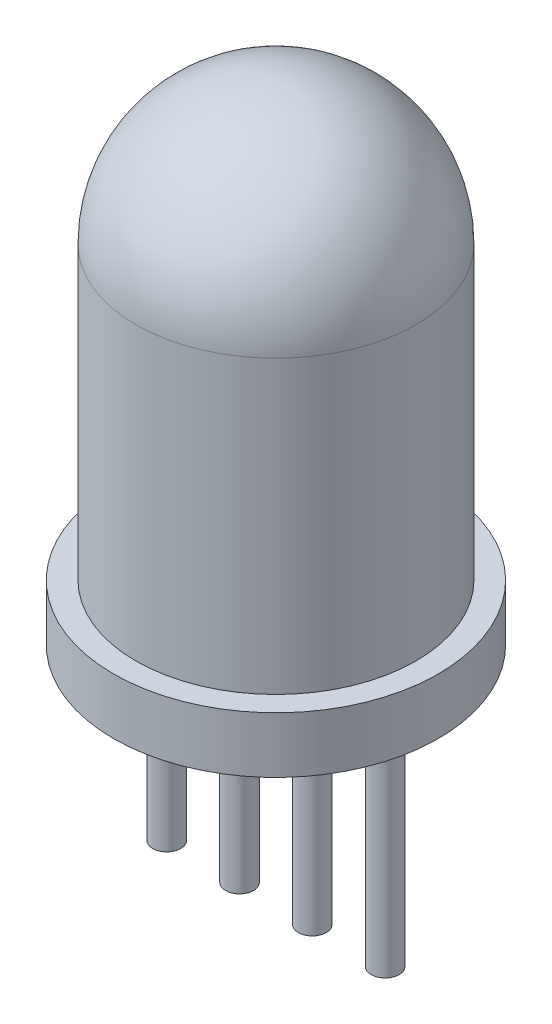
ISO-10303-21;
HEADER;
FILE_DESCRIPTION(('STEP AP214'),'2;1');
FILE_NAME('part.step','',(''),(''),'','','');
FILE_SCHEMA(('AUTOMOTIVE_DESIGN { 1 0 10303 214 1 1 1 1 }'));
ENDSEC;
DATA;
#1=APPLICATION_CONTEXT('core data for automotive mechanical design processes');
#2=APPLICATION_PROTOCOL_DEFINITION('international standard','automotive_design',2000,#1);
#3=PRODUCT_CONTEXT('',#1,'mechanical');
#4=PRODUCT('Part','Part','',(#3));
#5=PRODUCT_RELATED_PRODUCT_CATEGORY('part','',(#4));
#6=PRODUCT_DEFINITION_FORMATION('','',#4);
#7=PRODUCT_DEFINITION_CONTEXT('part definition',#1,'design');
#8=PRODUCT_DEFINITION('design','',#6,#7);
#9=PRODUCT_DEFINITION_SHAPE('','',#8);
#10=(LENGTH_UNIT() NAMED_UNIT(*) SI_UNIT(.MILLI.,.METRE.));
#11=(NAMED_UNIT(*) PLANE_ANGLE_UNIT() SI_UNIT($,.RADIAN.));
#12=(NAMED_UNIT(*) SI_UNIT($,.STERADIAN.) SOLID_ANGLE_UNIT());
#13=UNCERTAINTY_MEASURE_WITH_UNIT(LENGTH_MEASURE(1.E-05),#10,'distance_accuracy_value','');
#14=(GEOMETRIC_REPRESENTATION_CONTEXT(3) GLOBAL_UNCERTAINTY_ASSIGNED_CONTEXT((#13)) GLOBAL_UNIT_ASSIGNED_CONTEXT((#10,
#11,#12)) REPRESENTATION_CONTEXT('',''));
#15=CARTESIAN_POINT('',(0.,0.,0.));
#16=DIRECTION('',(0.,0.,1.));
#17=DIRECTION('',(1.,0.,0.));
#18=AXIS2_PLACEMENT_3D('',#15,#16,#17);
#19=CARTESIAN_POINT('',(0.,6.2,0.));
#20=DIRECTION('',(0.,1.,0.));
#21=DIRECTION('',(0.,0.,-1.));
#22=AXIS2_PLACEMENT_3D('',#19,#20,#21);
#23=SPHERICAL_SURFACE('',#22,2.5);
#24=CARTESIAN_POINT('',(0.,6.2,0.));
#25=DIRECTION('',(0.,1.,0.));
#26=DIRECTION('',(0.,0.,1.));
#27=AXIS2_PLACEMENT_3D('',#24,#25,#26);
#28=CIRCLE('',#27,2.5);
#29=CARTESIAN_POINT('',(0.,6.2,2.5));
#30=VERTEX_POINT('',#29);
#31=EDGE_CURVE('E49',#30,#30,#28,.T.);
#32=ORIENTED_EDGE('',*,*,#31,.T.);
#33=EDGE_LOOP('',(#32));
#34=FACE_BOUND('',#33,.T.);
#35=ADVANCED_FACE('F35',(#34),#23,.T.);
#36=CARTESIAN_POINT('',(0.,0.,2.9));
#37=DIRECTION('',(0.,-1.,0.));
#38=DIRECTION('',(0.,0.,-1.));
#39=AXIS2_PLACEMENT_3D('',#36,#37,#38);
#40=PLANE('',#39);
#41=CARTESIAN_POINT('',(1.95,0.,0.));
#42=DIRECTION('',(0.,-1.,0.));
#43=DIRECTION('',(0.,0.,1.));
#44=AXIS2_PLACEMENT_3D('',#41,#42,#43);
#45=CIRCLE('',#44,0.25);
#46=CARTESIAN_POINT('',(1.95,0.,0.250000000000001));
#47=VERTEX_POINT('',#46);
#48=EDGE_CURVE('E70',#47,#47,#45,.T.);
#49=ORIENTED_EDGE('',*,*,#48,.F.);
#50=EDGE_LOOP('',(#49));
#51=FACE_BOUND('',#50,.T.);
#52=CARTESIAN_POINT('',(0.65,0.,0.));
#53=DIRECTION('',(0.,-1.,0.));
#54=DIRECTION('',(0.,0.,1.));
#55=AXIS2_PLACEMENT_3D('',#52,#53,#54);
#56=CIRCLE('',#55,0.25);
#57=CARTESIAN_POINT('',(0.65,0.,0.25));
#58=VERTEX_POINT('',#57);
#59=EDGE_CURVE('E64',#58,#58,#56,.T.);
#60=ORIENTED_EDGE('',*,*,#59,.F.);
#61=EDGE_LOOP('',(#60));
#62=FACE_BOUND('',#61,.T.);
#63=CARTESIAN_POINT('',(-0.65,0.,0.));
#64=DIRECTION('',(0.,-1.,0.));
#65=DIRECTION('',(0.,0.,-1.));
#66=AXIS2_PLACEMENT_3D('',#63,#64,#65);
#67=CIRCLE('',#66,0.25);
#68=CARTESIAN_POINT('',(-0.65,0.,-0.25));
#69=VERTEX_POINT('',#68);
#70=EDGE_CURVE('E58',#69,#69,#67,.T.);
#71=ORIENTED_EDGE('',*,*,#70,.F.);
#72=EDGE_LOOP('',(#71));
#73=FACE_BOUND('',#72,.T.);
#74=CARTESIAN_POINT('',(-1.95,0.,0.));
#75=DIRECTION('',(0.,-1.,0.));
#76=DIRECTION('',(0.,0.,-1.));
#77=AXIS2_PLACEMENT_3D('',#74,#75,#76);
#78=CIRCLE('',#77,0.25);
#79=CARTESIAN_POINT('',(-1.95,0.,-0.25));
#80=VERTEX_POINT('',#79);
#81=EDGE_CURVE('E55',#80,#80,#78,.T.);
#82=ORIENTED_EDGE('',*,*,#81,.F.);
#83=EDGE_LOOP('',(#82));
#84=FACE_BOUND('',#83,.T.);
#85=CARTESIAN_POINT('',(0.,0.,0.));
#86=DIRECTION('',(0.,1.,0.));
#87=DIRECTION('',(0.,0.,1.));
#88=AXIS2_PLACEMENT_3D('',#85,#86,#87);
#89=CIRCLE('',#88,2.9);
#90=CARTESIAN_POINT('',(0.,0.,2.9));
#91=VERTEX_POINT('',#90);
#92=EDGE_CURVE('E10',#91,#91,#89,.T.);
#93=ORIENTED_EDGE('',*,*,#92,.F.);
#94=EDGE_LOOP('',(#93));
#95=FACE_BOUND('',#94,.T.);
#96=ADVANCED_FACE('F81',(#51,#62,#73,#84,#95),#40,.T.);
#97=CARTESIAN_POINT('',(0.,16.4775973247295,0.));
#98=DIRECTION('',(0.,1.,0.));
#99=DIRECTION('',(0.,0.,1.));
#100=AXIS2_PLACEMENT_3D('',#97,#98,#99);
#101=CYLINDRICAL_SURFACE('',#100,2.9);
#102=ORIENTED_EDGE('',*,*,#92,.T.);
#103=EDGE_LOOP('',(#102));
#104=FACE_BOUND('',#103,.T.);
#105=CARTESIAN_POINT('',(0.,1.,0.));
#106=DIRECTION('',(0.,1.,0.));
#107=DIRECTION('',(0.,0.,1.));
#108=AXIS2_PLACEMENT_3D('',#105,#106,#107);
#109=CIRCLE('',#108,2.9);
#110=CARTESIAN_POINT('',(0.,1.,2.9));
#111=VERTEX_POINT('',#110);
#112=EDGE_CURVE('E41',#111,#111,#109,.T.);
#113=ORIENTED_EDGE('',*,*,#112,.F.);
#114=EDGE_LOOP('',(#113));
#115=FACE_BOUND('',#114,.T.);
#116=ADVANCED_FACE('F84',(#104,#115),#101,.T.);
#117=CARTESIAN_POINT('',(0.,1.,2.5));
#118=DIRECTION('',(0.,1.,0.));
#119=DIRECTION('',(0.,0.,1.));
#120=AXIS2_PLACEMENT_3D('',#117,#118,#119);
#121=PLANE('',#120);
#122=ORIENTED_EDGE('',*,*,#112,.T.);
#123=EDGE_LOOP('',(#122));
#124=FACE_BOUND('',#123,.T.);
#125=CARTESIAN_POINT('',(0.,1.,0.));
#126=DIRECTION('',(0.,1.,0.));
#127=DIRECTION('',(0.,0.,1.));
#128=AXIS2_PLACEMENT_3D('',#125,#126,#127);
#129=CIRCLE('',#128,2.5);
#130=CARTESIAN_POINT('',(0.,1.,2.5));
#131=VERTEX_POINT('',#130);
#132=EDGE_CURVE('E45',#131,#131,#129,.T.);
#133=ORIENTED_EDGE('',*,*,#132,.F.);
#134=EDGE_LOOP('',(#133));
#135=FACE_BOUND('',#134,.T.);
#136=ADVANCED_FACE('F105',(#124,#135),#121,.T.);
#137=CARTESIAN_POINT('',(0.,16.4775973247295,0.));
#138=DIRECTION('',(0.,1.,0.));
#139=DIRECTION('',(0.,0.,1.));
#140=AXIS2_PLACEMENT_3D('',#137,#138,#139);
#141=CYLINDRICAL_SURFACE('',#140,2.5);
#142=ORIENTED_EDGE('',*,*,#132,.T.);
#143=EDGE_LOOP('',(#142));
#144=FACE_BOUND('',#143,.T.);
#145=ORIENTED_EDGE('',*,*,#31,.F.);
#146=EDGE_LOOP('',(#145));
#147=FACE_BOUND('',#146,.T.);
#148=ADVANCED_FACE('F95',(#144,#147),#141,.T.);
#149=CARTESIAN_POINT('',(-1.95,-4.,0.));
#150=DIRECTION('',(0.,1.,0.));
#151=DIRECTION('',(0.,0.,1.));
#152=AXIS2_PLACEMENT_3D('',#149,#150,#151);
#153=CYLINDRICAL_SURFACE('',#152,0.25);
#154=CARTESIAN_POINT('',(-1.95,-4.,0.));
#155=DIRECTION('',(0.,-1.,0.));
#156=DIRECTION('',(0.,0.,-1.));
#157=AXIS2_PLACEMENT_3D('',#154,#155,#156);
#158=CIRCLE('',#157,0.25);
#159=CARTESIAN_POINT('',(-1.95,-4.,-0.25));
#160=VERTEX_POINT('',#159);
#161=EDGE_CURVE('E54',#160,#160,#158,.T.);
#162=ORIENTED_EDGE('',*,*,#161,.F.);
#163=EDGE_LOOP('',(#162));
#164=FACE_BOUND('',#163,.T.);
#165=ORIENTED_EDGE('',*,*,#81,.T.);
#166=EDGE_LOOP('',(#165));
#167=FACE_BOUND('',#166,.T.);
#168=ADVANCED_FACE('F92',(#164,#167),#153,.T.);
#169=CARTESIAN_POINT('',(-1.95,-4.,0.));
#170=DIRECTION('',(0.,-1.,0.));
#171=DIRECTION('',(0.,0.,-1.));
#172=AXIS2_PLACEMENT_3D('',#169,#170,#171);
#173=PLANE('',#172);
#174=ORIENTED_EDGE('',*,*,#161,.T.);
#175=EDGE_LOOP('',(#174));
#176=FACE_BOUND('',#175,.T.);
#177=ADVANCED_FACE('F94',(#176),#173,.T.);
#178=CARTESIAN_POINT('',(-0.65,-4.,0.));
#179=DIRECTION('',(0.,1.,0.));
#180=DIRECTION('',(0.,0.,1.));
#181=AXIS2_PLACEMENT_3D('',#178,#179,#180);
#182=CYLINDRICAL_SURFACE('',#181,0.25);
#183=CARTESIAN_POINT('',(-0.65,-4.,0.));
#184=DIRECTION('',(0.,-1.,0.));
#185=DIRECTION('',(0.,0.,-1.));
#186=AXIS2_PLACEMENT_3D('',#183,#184,#185);
#187=CIRCLE('',#186,0.25);
#188=CARTESIAN_POINT('',(-0.65,-4.,-0.250000000000001));
#189=VERTEX_POINT('',#188);
#190=EDGE_CURVE('E61',#189,#189,#187,.T.);
#191=ORIENTED_EDGE('',*,*,#190,.F.);
#192=EDGE_LOOP('',(#191));
#193=FACE_BOUND('',#192,.T.);
#194=ORIENTED_EDGE('',*,*,#70,.T.);
#195=EDGE_LOOP('',(#194));
#196=FACE_BOUND('',#195,.T.);
#197=ADVANCED_FACE('F102',(#193,#196),#182,.T.);
#198=CARTESIAN_POINT('',(-0.65,-4.,0.));
#199=DIRECTION('',(0.,-1.,0.));
#200=DIRECTION('',(0.,0.,-1.));
#201=AXIS2_PLACEMENT_3D('',#198,#199,#200);
#202=PLANE('',#201);
#203=ORIENTED_EDGE('',*,*,#190,.T.);
#204=EDGE_LOOP('',(#203));
#205=FACE_BOUND('',#204,.T.);
#206=ADVANCED_FACE('F164',(#205),#202,.T.);
#207=CARTESIAN_POINT('',(0.65,-4.,0.));
#208=DIRECTION('',(0.,1.,0.));
#209=DIRECTION('',(0.,0.,1.));
#210=AXIS2_PLACEMENT_3D('',#207,#208,#209);
#211=CYLINDRICAL_SURFACE('',#210,0.25);
#212=CARTESIAN_POINT('',(0.65,-4.,0.));
#213=DIRECTION('',(0.,-1.,0.));
#214=DIRECTION('',(0.,0.,1.));
#215=AXIS2_PLACEMENT_3D('',#212,#213,#214);
#216=CIRCLE('',#215,0.25);
#217=CARTESIAN_POINT('',(0.65,-4.,0.25));
#218=VERTEX_POINT('',#217);
#219=EDGE_CURVE('E67',#218,#218,#216,.T.);
#220=ORIENTED_EDGE('',*,*,#219,.F.);
#221=EDGE_LOOP('',(#220));
#222=FACE_BOUND('',#221,.T.);
#223=ORIENTED_EDGE('',*,*,#59,.T.);
#224=EDGE_LOOP('',(#223));
#225=FACE_BOUND('',#224,.T.);
#226=ADVANCED_FACE('F175',(#222,#225),#211,.T.);
#227=CARTESIAN_POINT('',(0.65,-4.,0.));
#228=DIRECTION('',(0.,1.,0.));
#229=DIRECTION('',(0.,0.,1.));
#230=AXIS2_PLACEMENT_3D('',#227,#228,#229);
#231=PLANE('',#230);
#232=ORIENTED_EDGE('',*,*,#219,.T.);
#233=EDGE_LOOP('',(#232));
#234=FACE_BOUND('',#233,.T.);
#235=ADVANCED_FACE('F186',(#234),#231,.F.);
#236=CARTESIAN_POINT('',(1.95,-4.,0.));
#237=DIRECTION('',(0.,1.,0.));
#238=DIRECTION('',(0.,0.,1.));
#239=AXIS2_PLACEMENT_3D('',#236,#237,#238);
#240=CYLINDRICAL_SURFACE('',#239,0.25);
#241=CARTESIAN_POINT('',(1.95,-4.,0.));
#242=DIRECTION('',(0.,-1.,0.));
#243=DIRECTION('',(0.,0.,1.));
#244=AXIS2_PLACEMENT_3D('',#241,#242,#243);
#245=CIRCLE('',#244,0.25);
#246=CARTESIAN_POINT('',(1.95,-4.,0.25));
#247=VERTEX_POINT('',#246);
#248=EDGE_CURVE('E73',#247,#247,#245,.T.);
#249=ORIENTED_EDGE('',*,*,#248,.F.);
#250=EDGE_LOOP('',(#249));
#251=FACE_BOUND('',#250,.T.);
#252=ORIENTED_EDGE('',*,*,#48,.T.);
#253=EDGE_LOOP('',(#252));
#254=FACE_BOUND('',#253,.T.);
#255=ADVANCED_FACE('F79',(#251,#254),#240,.T.);
#256=CARTESIAN_POINT('',(1.95,-4.,0.));
#257=DIRECTION('',(0.,1.,0.));
#258=DIRECTION('',(0.,0.,1.));
#259=AXIS2_PLACEMENT_3D('',#256,#257,#258);
#260=PLANE('',#259);
#261=ORIENTED_EDGE('',*,*,#248,.T.);
#262=EDGE_LOOP('',(#261));
#263=FACE_BOUND('',#262,.T.);
#264=ADVANCED_FACE('F207',(#263),#260,.F.);
#265=CLOSED_SHELL('',(#35,#96,#116,#136,#148,#168,#177,#197,#206,#226,#235,#255,#264));
#266=MANIFOLD_SOLID_BREP('B2',#265);
#267=ADVANCED_BREP_SHAPE_REPRESENTATION('',(#18,#266),#14);
#268=SHAPE_DEFINITION_REPRESENTATION(#9,#267);
ENDSEC;
END-ISO-10303-21;
